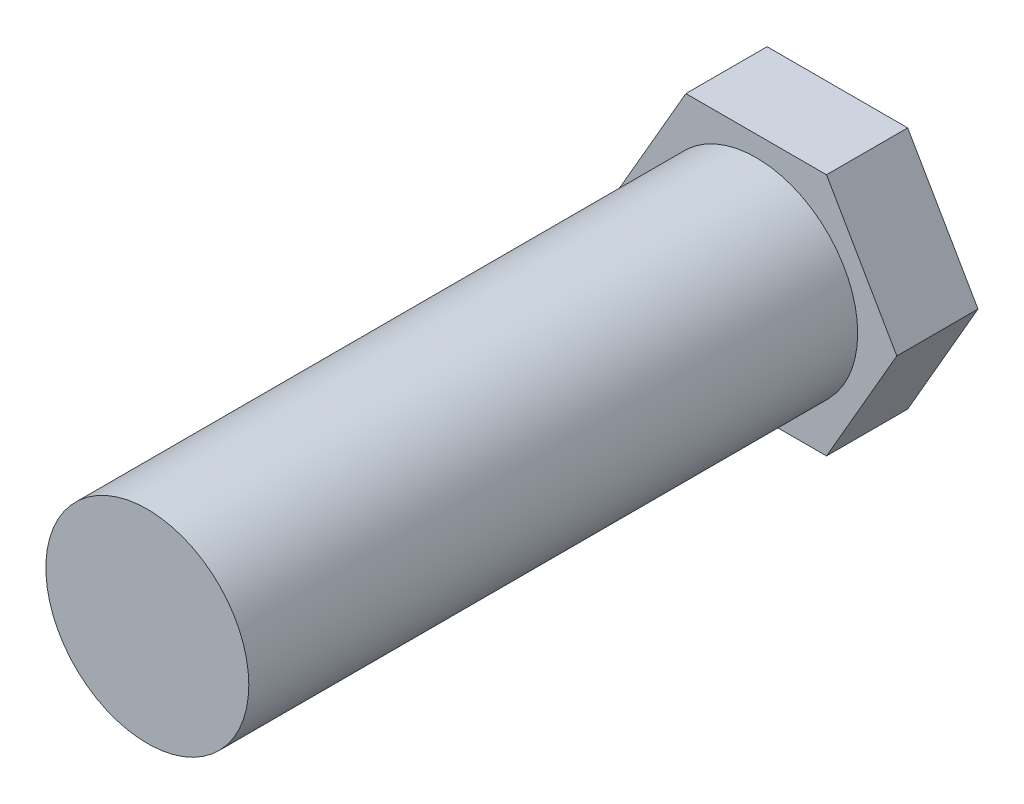
ISO-10303-21;
HEADER;
FILE_DESCRIPTION(('STEP AP214'),'2;1');
FILE_NAME('part.step','',(''),(''),'','','');
FILE_SCHEMA(('AUTOMOTIVE_DESIGN { 1 0 10303 214 1 1 1 1 }'));
ENDSEC;
DATA;
#1=APPLICATION_CONTEXT('core data for automotive mechanical design processes');
#2=APPLICATION_PROTOCOL_DEFINITION('international standard','automotive_design',2000,#1);
#3=PRODUCT_CONTEXT('',#1,'mechanical');
#4=PRODUCT('Part','Part','',(#3));
#5=PRODUCT_RELATED_PRODUCT_CATEGORY('part','',(#4));
#6=PRODUCT_DEFINITION_FORMATION('','',#4);
#7=PRODUCT_DEFINITION_CONTEXT('part definition',#1,'design');
#8=PRODUCT_DEFINITION('design','',#6,#7);
#9=PRODUCT_DEFINITION_SHAPE('','',#8);
#10=(LENGTH_UNIT() NAMED_UNIT(*) SI_UNIT(.MILLI.,.METRE.));
#11=(NAMED_UNIT(*) PLANE_ANGLE_UNIT() SI_UNIT($,.RADIAN.));
#12=(NAMED_UNIT(*) SI_UNIT($,.STERADIAN.) SOLID_ANGLE_UNIT());
#13=UNCERTAINTY_MEASURE_WITH_UNIT(LENGTH_MEASURE(1.E-05),#10,'distance_accuracy_value','');
#14=(GEOMETRIC_REPRESENTATION_CONTEXT(3) GLOBAL_UNCERTAINTY_ASSIGNED_CONTEXT((#13)) GLOBAL_UNIT_ASSIGNED_CONTEXT((#10,
#11,#12)) REPRESENTATION_CONTEXT('',''));
#15=CARTESIAN_POINT('',(0.,0.,0.));
#16=DIRECTION('',(0.,0.,1.));
#17=DIRECTION('',(1.,0.,0.));
#18=AXIS2_PLACEMENT_3D('',#15,#16,#17);
#19=CARTESIAN_POINT('',(0.346410161513776,0.,0.2));
#20=DIRECTION('',(-0.866025403784438,-0.5,0.));
#21=DIRECTION('',(0.5,-0.866025403784439,0.));
#22=AXIS2_PLACEMENT_3D('',#19,#20,#21);
#23=PLANE('',#22);
#24=DIRECTION('',(-0.5,0.866025403784438,0.));
#25=VECTOR('',#24,1.);
#26=CARTESIAN_POINT('',(0.346410161513776,0.,0.));
#27=LINE('',#26,#25);
#28=CARTESIAN_POINT('',(0.346410161513776,0.,0.));
#29=VERTEX_POINT('',#28);
#30=CARTESIAN_POINT('',(0.173205080756888,0.3,0.));
#31=VERTEX_POINT('',#30);
#32=EDGE_CURVE('E121',#29,#31,#27,.T.);
#33=ORIENTED_EDGE('',*,*,#32,.T.);
#34=DIRECTION('',(0.,0.,-1.));
#35=VECTOR('',#34,1.);
#36=CARTESIAN_POINT('',(0.173205080756888,0.3,0.2));
#37=LINE('',#36,#35);
#38=CARTESIAN_POINT('',(0.173205080756888,0.3,0.2));
#39=VERTEX_POINT('',#38);
#40=EDGE_CURVE('E38',#39,#31,#37,.T.);
#41=ORIENTED_EDGE('',*,*,#40,.F.);
#42=DIRECTION('',(-0.5,0.866025403784438,0.));
#43=VECTOR('',#42,1.);
#44=CARTESIAN_POINT('',(0.346410161513776,0.,0.2));
#45=LINE('',#44,#43);
#46=CARTESIAN_POINT('',(0.346410161513776,0.,0.2));
#47=VERTEX_POINT('',#46);
#48=EDGE_CURVE('E132',#47,#39,#45,.T.);
#49=ORIENTED_EDGE('',*,*,#48,.F.);
#50=DIRECTION('',(0.,0.,-1.));
#51=VECTOR('',#50,1.);
#52=CARTESIAN_POINT('',(0.346410161513776,0.,0.2));
#53=LINE('',#52,#51);
#54=EDGE_CURVE('E117',#47,#29,#53,.T.);
#55=ORIENTED_EDGE('',*,*,#54,.T.);
#56=EDGE_LOOP('',(#33,#41,#49,#55));
#57=FACE_BOUND('',#56,.T.);
#58=ADVANCED_FACE('F35',(#57),#23,.F.);
#59=CARTESIAN_POINT('',(0.173205080756888,0.3,0.2));
#60=DIRECTION('',(0.,-1.,0.));
#61=DIRECTION('',(0.,0.,-1.));
#62=AXIS2_PLACEMENT_3D('',#59,#60,#61);
#63=PLANE('',#62);
#64=DIRECTION('',(-1.,0.,0.));
#65=VECTOR('',#64,1.);
#66=CARTESIAN_POINT('',(0.173205080756888,0.3,0.));
#67=LINE('',#66,#65);
#68=CARTESIAN_POINT('',(-0.173205080756888,0.3,0.));
#69=VERTEX_POINT('',#68);
#70=EDGE_CURVE('E124',#31,#69,#67,.T.);
#71=ORIENTED_EDGE('',*,*,#70,.T.);
#72=DIRECTION('',(0.,0.,-1.));
#73=VECTOR('',#72,1.);
#74=CARTESIAN_POINT('',(-0.173205080756888,0.3,0.2));
#75=LINE('',#74,#73);
#76=CARTESIAN_POINT('',(-0.173205080756888,0.3,0.2));
#77=VERTEX_POINT('',#76);
#78=EDGE_CURVE('E135',#77,#69,#75,.T.);
#79=ORIENTED_EDGE('',*,*,#78,.F.);
#80=DIRECTION('',(-1.,0.,0.));
#81=VECTOR('',#80,1.);
#82=CARTESIAN_POINT('',(0.173205080756888,0.3,0.2));
#83=LINE('',#82,#81);
#84=EDGE_CURVE('E90',#39,#77,#83,.T.);
#85=ORIENTED_EDGE('',*,*,#84,.F.);
#86=ORIENTED_EDGE('',*,*,#40,.T.);
#87=EDGE_LOOP('',(#71,#79,#85,#86));
#88=FACE_BOUND('',#87,.T.);
#89=ADVANCED_FACE('F140',(#88),#63,.F.);
#90=CARTESIAN_POINT('',(-0.173205080756888,0.3,0.2));
#91=DIRECTION('',(0.866025403784439,-0.5,0.));
#92=DIRECTION('',(0.5,0.866025403784439,0.));
#93=AXIS2_PLACEMENT_3D('',#90,#91,#92);
#94=PLANE('',#93);
#95=DIRECTION('',(-0.5,-0.866025403784439,0.));
#96=VECTOR('',#95,1.);
#97=CARTESIAN_POINT('',(-0.173205080756888,0.3,0.));
#98=LINE('',#97,#96);
#99=CARTESIAN_POINT('',(-0.346410161513775,0.,0.));
#100=VERTEX_POINT('',#99);
#101=EDGE_CURVE('E127',#69,#100,#98,.T.);
#102=ORIENTED_EDGE('',*,*,#101,.T.);
#103=DIRECTION('',(0.,0.,-1.));
#104=VECTOR('',#103,1.);
#105=CARTESIAN_POINT('',(-0.346410161513775,0.,0.2));
#106=LINE('',#105,#104);
#107=CARTESIAN_POINT('',(-0.346410161513775,0.,0.2));
#108=VERTEX_POINT('',#107);
#109=EDGE_CURVE('E112',#108,#100,#106,.T.);
#110=ORIENTED_EDGE('',*,*,#109,.F.);
#111=DIRECTION('',(-0.5,-0.866025403784439,0.));
#112=VECTOR('',#111,1.);
#113=CARTESIAN_POINT('',(-0.173205080756888,0.3,0.2));
#114=LINE('',#113,#112);
#115=EDGE_CURVE('E103',#77,#108,#114,.T.);
#116=ORIENTED_EDGE('',*,*,#115,.F.);
#117=ORIENTED_EDGE('',*,*,#78,.T.);
#118=EDGE_LOOP('',(#102,#110,#116,#117));
#119=FACE_BOUND('',#118,.T.);
#120=ADVANCED_FACE('F146',(#119),#94,.F.);
#121=CARTESIAN_POINT('',(-0.346410161513775,0.,0.2));
#122=DIRECTION('',(0.866025403784438,0.5,0.));
#123=DIRECTION('',(-0.5,0.866025403784438,0.));
#124=AXIS2_PLACEMENT_3D('',#121,#122,#123);
#125=PLANE('',#124);
#126=DIRECTION('',(0.5,-0.866025403784438,0.));
#127=VECTOR('',#126,1.);
#128=CARTESIAN_POINT('',(-0.346410161513775,0.,0.));
#129=LINE('',#128,#127);
#130=CARTESIAN_POINT('',(-0.173205080756887,-0.3,0.));
#131=VERTEX_POINT('',#130);
#132=EDGE_CURVE('E111',#100,#131,#129,.T.);
#133=ORIENTED_EDGE('',*,*,#132,.T.);
#134=DIRECTION('',(0.,0.,-1.));
#135=VECTOR('',#134,1.);
#136=CARTESIAN_POINT('',(-0.173205080756887,-0.3,0.2));
#137=LINE('',#136,#135);
#138=CARTESIAN_POINT('',(-0.173205080756887,-0.3,0.2));
#139=VERTEX_POINT('',#138);
#140=EDGE_CURVE('E108',#139,#131,#137,.T.);
#141=ORIENTED_EDGE('',*,*,#140,.F.);
#142=DIRECTION('',(0.5,-0.866025403784438,0.));
#143=VECTOR('',#142,1.);
#144=CARTESIAN_POINT('',(-0.346410161513775,0.,0.2));
#145=LINE('',#144,#143);
#146=EDGE_CURVE('E97',#108,#139,#145,.T.);
#147=ORIENTED_EDGE('',*,*,#146,.F.);
#148=ORIENTED_EDGE('',*,*,#109,.T.);
#149=EDGE_LOOP('',(#133,#141,#147,#148));
#150=FACE_BOUND('',#149,.T.);
#151=ADVANCED_FACE('F109',(#150),#125,.F.);
#152=CARTESIAN_POINT('',(-0.173205080756887,-0.3,0.2));
#153=DIRECTION('',(0.,1.,0.));
#154=DIRECTION('',(0.,0.,1.));
#155=AXIS2_PLACEMENT_3D('',#152,#153,#154);
#156=PLANE('',#155);
#157=DIRECTION('',(1.,0.,0.));
#158=VECTOR('',#157,1.);
#159=CARTESIAN_POINT('',(-0.173205080756887,-0.3,0.));
#160=LINE('',#159,#158);
#161=CARTESIAN_POINT('',(0.173205080756888,-0.3,0.));
#162=VERTEX_POINT('',#161);
#163=EDGE_CURVE('E75',#131,#162,#160,.T.);
#164=ORIENTED_EDGE('',*,*,#163,.T.);
#165=DIRECTION('',(0.,0.,-1.));
#166=VECTOR('',#165,1.);
#167=CARTESIAN_POINT('',(0.173205080756888,-0.3,0.2));
#168=LINE('',#167,#166);
#169=CARTESIAN_POINT('',(0.173205080756888,-0.3,0.2));
#170=VERTEX_POINT('',#169);
#171=EDGE_CURVE('E113',#170,#162,#168,.T.);
#172=ORIENTED_EDGE('',*,*,#171,.F.);
#173=DIRECTION('',(1.,0.,0.));
#174=VECTOR('',#173,1.);
#175=CARTESIAN_POINT('',(-0.173205080756887,-0.3,0.2));
#176=LINE('',#175,#174);
#177=EDGE_CURVE('E101',#139,#170,#176,.T.);
#178=ORIENTED_EDGE('',*,*,#177,.F.);
#179=ORIENTED_EDGE('',*,*,#140,.T.);
#180=EDGE_LOOP('',(#164,#172,#178,#179));
#181=FACE_BOUND('',#180,.T.);
#182=ADVANCED_FACE('F115',(#181),#156,.F.);
#183=CARTESIAN_POINT('',(0.173205080756888,-0.3,0.2));
#184=DIRECTION('',(-0.866025403784439,0.5,0.));
#185=DIRECTION('',(-0.5,-0.866025403784439,0.));
#186=AXIS2_PLACEMENT_3D('',#183,#184,#185);
#187=PLANE('',#186);
#188=DIRECTION('',(0.5,0.866025403784439,0.));
#189=VECTOR('',#188,1.);
#190=CARTESIAN_POINT('',(0.173205080756888,-0.3,0.));
#191=LINE('',#190,#189);
#192=EDGE_CURVE('E81',#162,#29,#191,.T.);
#193=ORIENTED_EDGE('',*,*,#192,.T.);
#194=ORIENTED_EDGE('',*,*,#54,.F.);
#195=DIRECTION('',(0.5,0.866025403784439,0.));
#196=VECTOR('',#195,1.);
#197=CARTESIAN_POINT('',(0.173205080756888,-0.3,0.2));
#198=LINE('',#197,#196);
#199=EDGE_CURVE('E52',#170,#47,#198,.T.);
#200=ORIENTED_EDGE('',*,*,#199,.F.);
#201=ORIENTED_EDGE('',*,*,#171,.T.);
#202=EDGE_LOOP('',(#193,#194,#200,#201));
#203=FACE_BOUND('',#202,.T.);
#204=ADVANCED_FACE('F162',(#203),#187,.F.);
#205=CARTESIAN_POINT('',(0.,0.,0.2));
#206=DIRECTION('',(0.,0.,1.));
#207=DIRECTION('',(1.,0.,0.));
#208=AXIS2_PLACEMENT_3D('',#205,#206,#207);
#209=PLANE('',#208);
#210=CARTESIAN_POINT('',(0.,0.,0.2));
#211=DIRECTION('',(0.,0.,1.));
#212=DIRECTION('',(1.,0.,0.));
#213=AXIS2_PLACEMENT_3D('',#210,#211,#212);
#214=CIRCLE('',#213,0.25);
#215=CARTESIAN_POINT('',(0.25,0.,0.2));
#216=VERTEX_POINT('',#215);
#217=EDGE_CURVE('E11',#216,#216,#214,.T.);
#218=ORIENTED_EDGE('',*,*,#217,.F.);
#219=EDGE_LOOP('',(#218));
#220=FACE_BOUND('',#219,.T.);
#221=ORIENTED_EDGE('',*,*,#48,.T.);
#222=ORIENTED_EDGE('',*,*,#84,.T.);
#223=ORIENTED_EDGE('',*,*,#115,.T.);
#224=ORIENTED_EDGE('',*,*,#146,.T.);
#225=ORIENTED_EDGE('',*,*,#177,.T.);
#226=ORIENTED_EDGE('',*,*,#199,.T.);
#227=EDGE_LOOP('',(#221,#222,#223,#224,#225,#226));
#228=FACE_BOUND('',#227,.T.);
#229=ADVANCED_FACE('F99',(#220,#228),#209,.T.);
#230=CARTESIAN_POINT('',(0.,0.,0.));
#231=DIRECTION('',(0.,0.,1.));
#232=DIRECTION('',(1.,0.,0.));
#233=AXIS2_PLACEMENT_3D('',#230,#231,#232);
#234=PLANE('',#233);
#235=ORIENTED_EDGE('',*,*,#32,.F.);
#236=ORIENTED_EDGE('',*,*,#192,.F.);
#237=ORIENTED_EDGE('',*,*,#163,.F.);
#238=ORIENTED_EDGE('',*,*,#132,.F.);
#239=ORIENTED_EDGE('',*,*,#101,.F.);
#240=ORIENTED_EDGE('',*,*,#70,.F.);
#241=EDGE_LOOP('',(#235,#236,#237,#238,#239,#240));
#242=FACE_BOUND('',#241,.T.);
#243=ADVANCED_FACE('F145',(#242),#234,.F.);
#244=CARTESIAN_POINT('',(0.,0.,1.7));
#245=DIRECTION('',(0.,0.,-1.));
#246=DIRECTION('',(-1.,0.,0.));
#247=AXIS2_PLACEMENT_3D('',#244,#245,#246);
#248=CYLINDRICAL_SURFACE('',#247,0.25);
#249=CARTESIAN_POINT('',(0.,0.,1.7));
#250=DIRECTION('',(0.,0.,1.));
#251=DIRECTION('',(1.,0.,0.));
#252=AXIS2_PLACEMENT_3D('',#249,#250,#251);
#253=CIRCLE('',#252,0.25);
#254=CARTESIAN_POINT('',(0.25,0.,1.7));
#255=VERTEX_POINT('',#254);
#256=EDGE_CURVE('E125',#255,#255,#253,.T.);
#257=ORIENTED_EDGE('',*,*,#256,.F.);
#258=EDGE_LOOP('',(#257));
#259=FACE_BOUND('',#258,.T.);
#260=ORIENTED_EDGE('',*,*,#217,.T.);
#261=EDGE_LOOP('',(#260));
#262=FACE_BOUND('',#261,.T.);
#263=ADVANCED_FACE('F155',(#259,#262),#248,.T.);
#264=CARTESIAN_POINT('',(0.,0.,1.7));
#265=DIRECTION('',(0.,0.,1.));
#266=DIRECTION('',(1.,0.,0.));
#267=AXIS2_PLACEMENT_3D('',#264,#265,#266);
#268=PLANE('',#267);
#269=ORIENTED_EDGE('',*,*,#256,.T.);
#270=EDGE_LOOP('',(#269));
#271=FACE_BOUND('',#270,.T.);
#272=ADVANCED_FACE('F153',(#271),#268,.T.);
#273=CLOSED_SHELL('',(#58,#89,#120,#151,#182,#204,#229,#243,#263,#272));
#274=MANIFOLD_SOLID_BREP('B2',#273);
#275=ADVANCED_BREP_SHAPE_REPRESENTATION('',(#18,#274),#14);
#276=SHAPE_DEFINITION_REPRESENTATION(#9,#275);
ENDSEC;
END-ISO-10303-21;
